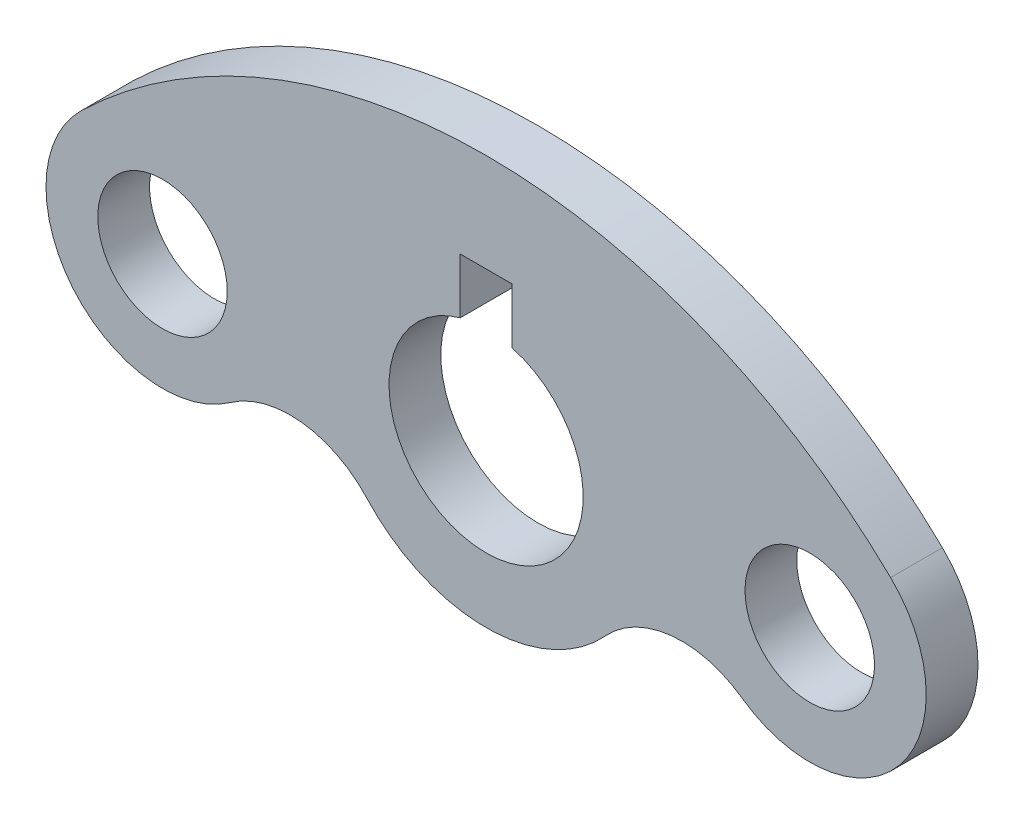
ISO-10303-21;
HEADER;
FILE_DESCRIPTION(('STEP AP214'),'2;1');
FILE_NAME('part.step','',(''),(''),'','','');
FILE_SCHEMA(('AUTOMOTIVE_DESIGN { 1 0 10303 214 1 1 1 1 }'));
ENDSEC;
DATA;
#1=APPLICATION_CONTEXT('core data for automotive mechanical design processes');
#2=APPLICATION_PROTOCOL_DEFINITION('international standard','automotive_design',2000,#1);
#3=PRODUCT_CONTEXT('',#1,'mechanical');
#4=PRODUCT('Part','Part','',(#3));
#5=PRODUCT_RELATED_PRODUCT_CATEGORY('part','',(#4));
#6=PRODUCT_DEFINITION_FORMATION('','',#4);
#7=PRODUCT_DEFINITION_CONTEXT('part definition',#1,'design');
#8=PRODUCT_DEFINITION('design','',#6,#7);
#9=PRODUCT_DEFINITION_SHAPE('','',#8);
#10=(LENGTH_UNIT() NAMED_UNIT(*) SI_UNIT(.MILLI.,.METRE.));
#11=(NAMED_UNIT(*) PLANE_ANGLE_UNIT() SI_UNIT($,.RADIAN.));
#12=(NAMED_UNIT(*) SI_UNIT($,.STERADIAN.) SOLID_ANGLE_UNIT());
#13=UNCERTAINTY_MEASURE_WITH_UNIT(LENGTH_MEASURE(1.E-05),#10,'distance_accuracy_value','');
#14=(GEOMETRIC_REPRESENTATION_CONTEXT(3) GLOBAL_UNCERTAINTY_ASSIGNED_CONTEXT((#13)) GLOBAL_UNIT_ASSIGNED_CONTEXT((#10,
#11,#12)) REPRESENTATION_CONTEXT('',''));
#15=CARTESIAN_POINT('',(0.,0.,0.));
#16=DIRECTION('',(0.,0.,1.));
#17=DIRECTION('',(1.,0.,0.));
#18=AXIS2_PLACEMENT_3D('',#15,#16,#17);
#19=CARTESIAN_POINT('',(25.,-25.9036676939772,8.));
#20=DIRECTION('',(0.,0.,1.));
#21=DIRECTION('',(1.,0.,0.));
#22=AXIS2_PLACEMENT_3D('',#19,#20,#21);
#23=PLANE('',#22);
#24=CARTESIAN_POINT('',(0.,0.,8.));
#25=DIRECTION('',(0.,0.,1.));
#26=DIRECTION('',(1.,0.,0.));
#27=AXIS2_PLACEMENT_3D('',#24,#25,#26);
#28=CIRCLE('',#27,15.);
#29=CARTESIAN_POINT('',(-4.,14.456832294801,8.));
#30=VERTEX_POINT('',#29);
#31=CARTESIAN_POINT('',(4.,14.456832294801,8.));
#32=VERTEX_POINT('',#31);
#33=EDGE_CURVE('E118',#30,#32,#28,.T.);
#34=ORIENTED_EDGE('',*,*,#33,.F.);
#35=DIRECTION('',(0.,-1.,0.));
#36=VECTOR('',#35,1.);
#37=CARTESIAN_POINT('',(-4.,23.,8.));
#38=LINE('',#37,#36);
#39=CARTESIAN_POINT('',(-4.,23.,8.));
#40=VERTEX_POINT('',#39);
#41=EDGE_CURVE('E110',#40,#30,#38,.T.);
#42=ORIENTED_EDGE('',*,*,#41,.F.);
#43=DIRECTION('',(-1.,0.,0.));
#44=VECTOR('',#43,1.);
#45=CARTESIAN_POINT('',(4.,23.,8.));
#46=LINE('',#45,#44);
#47=CARTESIAN_POINT('',(4.,23.,8.));
#48=VERTEX_POINT('',#47);
#49=EDGE_CURVE('E133',#48,#40,#46,.T.);
#50=ORIENTED_EDGE('',*,*,#49,.F.);
#51=DIRECTION('',(0.,1.,0.));
#52=VECTOR('',#51,1.);
#53=CARTESIAN_POINT('',(4.,14.456832294801,8.));
#54=LINE('',#53,#52);
#55=EDGE_CURVE('E131',#32,#48,#54,.T.);
#56=ORIENTED_EDGE('',*,*,#55,.F.);
#57=EDGE_LOOP('',(#34,#42,#50,#56));
#58=FACE_BOUND('',#57,.T.);
#59=CARTESIAN_POINT('',(-50.,0.,8.));
#60=DIRECTION('',(0.,0.,1.));
#61=DIRECTION('',(1.,0.,0.));
#62=AXIS2_PLACEMENT_3D('',#59,#60,#61);
#63=CIRCLE('',#62,10.);
#64=CARTESIAN_POINT('',(-40.,0.,8.));
#65=VERTEX_POINT('',#64);
#66=EDGE_CURVE('E149',#65,#65,#63,.T.);
#67=ORIENTED_EDGE('',*,*,#66,.F.);
#68=EDGE_LOOP('',(#67));
#69=FACE_BOUND('',#68,.T.);
#70=CARTESIAN_POINT('',(50.,0.,8.));
#71=DIRECTION('',(0.,0.,1.));
#72=DIRECTION('',(1.,0.,0.));
#73=AXIS2_PLACEMENT_3D('',#70,#71,#72);
#74=CIRCLE('',#73,18.);
#75=CARTESIAN_POINT('',(39.5441176470588,-14.6517754631121,8.));
#76=VERTEX_POINT('',#75);
#77=CARTESIAN_POINT('',(62.5,12.9518338469886,8.));
#78=VERTEX_POINT('',#77);
#79=EDGE_CURVE('E155',#76,#78,#74,.T.);
#80=ORIENTED_EDGE('',*,*,#79,.T.);
#81=CARTESIAN_POINT('',(0.,-51.8073353879545,8.));
#82=DIRECTION('',(0.,0.,1.));
#83=DIRECTION('',(-1.,0.,0.));
#84=AXIS2_PLACEMENT_3D('',#81,#82,#83);
#85=CIRCLE('',#84,90.);
#86=CARTESIAN_POINT('',(-62.5,12.9518338469886,8.));
#87=VERTEX_POINT('',#86);
#88=EDGE_CURVE('E158',#78,#87,#85,.T.);
#89=ORIENTED_EDGE('',*,*,#88,.T.);
#90=CARTESIAN_POINT('',(-50.,0.,8.));
#91=DIRECTION('',(0.,0.,1.));
#92=DIRECTION('',(1.,0.,0.));
#93=AXIS2_PLACEMENT_3D('',#90,#91,#92);
#94=CIRCLE('',#93,18.);
#95=CARTESIAN_POINT('',(-39.5441176470588,-14.6517754631121,8.));
#96=VERTEX_POINT('',#95);
#97=EDGE_CURVE('E161',#87,#96,#94,.T.);
#98=ORIENTED_EDGE('',*,*,#97,.T.);
#99=CARTESIAN_POINT('',(-30.25,-27.6755758747673,8.));
#100=DIRECTION('',(0.,0.,-1.));
#101=DIRECTION('',(1.,0.,0.));
#102=AXIS2_PLACEMENT_3D('',#99,#100,#101);
#103=CIRCLE('',#102,16.);
#104=CARTESIAN_POINT('',(-18.4451219512195,-16.8753511431508,8.));
#105=VERTEX_POINT('',#104);
#106=EDGE_CURVE('E163',#96,#105,#103,.T.);
#107=ORIENTED_EDGE('',*,*,#106,.T.);
#108=CARTESIAN_POINT('',(0.,0.,8.));
#109=DIRECTION('',(0.,0.,1.));
#110=DIRECTION('',(1.,0.,0.));
#111=AXIS2_PLACEMENT_3D('',#108,#109,#110);
#112=CIRCLE('',#111,25.);
#113=CARTESIAN_POINT('',(18.4451219512195,-16.8753511431508,8.));
#114=VERTEX_POINT('',#113);
#115=EDGE_CURVE('E165',#105,#114,#112,.T.);
#116=ORIENTED_EDGE('',*,*,#115,.T.);
#117=CARTESIAN_POINT('',(30.25,-27.6755758747673,8.));
#118=DIRECTION('',(0.,0.,-1.));
#119=DIRECTION('',(-1.,0.,0.));
#120=AXIS2_PLACEMENT_3D('',#117,#118,#119);
#121=CIRCLE('',#120,16.);
#122=EDGE_CURVE('E167',#114,#76,#121,.T.);
#123=ORIENTED_EDGE('',*,*,#122,.T.);
#124=EDGE_LOOP('',(#80,#89,#98,#107,#116,#123));
#125=FACE_BOUND('',#124,.T.);
#126=CARTESIAN_POINT('',(50.,0.,8.));
#127=DIRECTION('',(0.,0.,1.));
#128=DIRECTION('',(-1.,0.,0.));
#129=AXIS2_PLACEMENT_3D('',#126,#127,#128);
#130=CIRCLE('',#129,10.);
#131=CARTESIAN_POINT('',(40.,0.,8.));
#132=VERTEX_POINT('',#131);
#133=EDGE_CURVE('E139',#132,#132,#130,.T.);
#134=ORIENTED_EDGE('',*,*,#133,.F.);
#135=EDGE_LOOP('',(#134));
#136=FACE_BOUND('',#135,.T.);
#137=ADVANCED_FACE('F33',(#58,#69,#125,#136),#23,.T.);
#138=CARTESIAN_POINT('',(25.,-25.9036676939772,0.));
#139=DIRECTION('',(0.,0.,1.));
#140=DIRECTION('',(1.,0.,0.));
#141=AXIS2_PLACEMENT_3D('',#138,#139,#140);
#142=PLANE('',#141);
#143=CARTESIAN_POINT('',(-50.,0.,0.));
#144=DIRECTION('',(0.,0.,1.));
#145=DIRECTION('',(1.,0.,0.));
#146=AXIS2_PLACEMENT_3D('',#143,#144,#145);
#147=CIRCLE('',#146,10.);
#148=CARTESIAN_POINT('',(-40.,0.,0.));
#149=VERTEX_POINT('',#148);
#150=EDGE_CURVE('E126',#149,#149,#147,.T.);
#151=ORIENTED_EDGE('',*,*,#150,.T.);
#152=EDGE_LOOP('',(#151));
#153=FACE_BOUND('',#152,.T.);
#154=CARTESIAN_POINT('',(50.,0.,0.));
#155=DIRECTION('',(0.,0.,1.));
#156=DIRECTION('',(1.,0.,0.));
#157=AXIS2_PLACEMENT_3D('',#154,#155,#156);
#158=CIRCLE('',#157,18.);
#159=CARTESIAN_POINT('',(39.5441176470588,-14.6517754631121,0.));
#160=VERTEX_POINT('',#159);
#161=CARTESIAN_POINT('',(62.5,12.9518338469886,0.));
#162=VERTEX_POINT('',#161);
#163=EDGE_CURVE('E152',#160,#162,#158,.T.);
#164=ORIENTED_EDGE('',*,*,#163,.F.);
#165=CARTESIAN_POINT('',(30.25,-27.6755758747673,0.));
#166=DIRECTION('',(0.,0.,-1.));
#167=DIRECTION('',(-1.,0.,0.));
#168=AXIS2_PLACEMENT_3D('',#165,#166,#167);
#169=CIRCLE('',#168,16.);
#170=CARTESIAN_POINT('',(18.4451219512195,-16.8753511431508,0.));
#171=VERTEX_POINT('',#170);
#172=EDGE_CURVE('E159',#171,#160,#169,.T.);
#173=ORIENTED_EDGE('',*,*,#172,.F.);
#174=CARTESIAN_POINT('',(0.,0.,0.));
#175=DIRECTION('',(0.,0.,1.));
#176=DIRECTION('',(1.,0.,0.));
#177=AXIS2_PLACEMENT_3D('',#174,#175,#176);
#178=CIRCLE('',#177,25.);
#179=CARTESIAN_POINT('',(-18.4451219512195,-16.8753511431508,0.));
#180=VERTEX_POINT('',#179);
#181=EDGE_CURVE('E178',#180,#171,#178,.T.);
#182=ORIENTED_EDGE('',*,*,#181,.F.);
#183=CARTESIAN_POINT('',(-30.25,-27.6755758747673,0.));
#184=DIRECTION('',(0.,0.,-1.));
#185=DIRECTION('',(1.,0.,0.));
#186=AXIS2_PLACEMENT_3D('',#183,#184,#185);
#187=CIRCLE('',#186,16.);
#188=CARTESIAN_POINT('',(-39.5441176470588,-14.6517754631121,0.));
#189=VERTEX_POINT('',#188);
#190=EDGE_CURVE('E176',#189,#180,#187,.T.);
#191=ORIENTED_EDGE('',*,*,#190,.F.);
#192=CARTESIAN_POINT('',(-50.,0.,0.));
#193=DIRECTION('',(0.,0.,1.));
#194=DIRECTION('',(1.,0.,0.));
#195=AXIS2_PLACEMENT_3D('',#192,#193,#194);
#196=CIRCLE('',#195,18.);
#197=CARTESIAN_POINT('',(-62.5,12.9518338469886,0.));
#198=VERTEX_POINT('',#197);
#199=EDGE_CURVE('E174',#198,#189,#196,.T.);
#200=ORIENTED_EDGE('',*,*,#199,.F.);
#201=CARTESIAN_POINT('',(0.,-51.8073353879545,0.));
#202=DIRECTION('',(0.,0.,1.));
#203=DIRECTION('',(-1.,0.,0.));
#204=AXIS2_PLACEMENT_3D('',#201,#202,#203);
#205=CIRCLE('',#204,90.);
#206=EDGE_CURVE('E172',#162,#198,#205,.T.);
#207=ORIENTED_EDGE('',*,*,#206,.F.);
#208=EDGE_LOOP('',(#164,#173,#182,#191,#200,#207));
#209=FACE_BOUND('',#208,.T.);
#210=DIRECTION('',(0.,-1.,0.));
#211=VECTOR('',#210,1.);
#212=CARTESIAN_POINT('',(-4.,23.,0.));
#213=LINE('',#212,#211);
#214=CARTESIAN_POINT('',(-4.,23.,0.));
#215=VERTEX_POINT('',#214);
#216=CARTESIAN_POINT('',(-4.,14.456832294801,0.));
#217=VERTEX_POINT('',#216);
#218=EDGE_CURVE('E56',#215,#217,#213,.T.);
#219=ORIENTED_EDGE('',*,*,#218,.T.);
#220=CARTESIAN_POINT('',(0.,0.,0.));
#221=DIRECTION('',(0.,0.,1.));
#222=DIRECTION('',(1.,0.,0.));
#223=AXIS2_PLACEMENT_3D('',#220,#221,#222);
#224=CIRCLE('',#223,15.);
#225=CARTESIAN_POINT('',(4.,14.456832294801,0.));
#226=VERTEX_POINT('',#225);
#227=EDGE_CURVE('E125',#217,#226,#224,.T.);
#228=ORIENTED_EDGE('',*,*,#227,.T.);
#229=DIRECTION('',(0.,1.,0.));
#230=VECTOR('',#229,1.);
#231=CARTESIAN_POINT('',(4.,14.456832294801,0.));
#232=LINE('',#231,#230);
#233=CARTESIAN_POINT('',(4.,23.,0.));
#234=VERTEX_POINT('',#233);
#235=EDGE_CURVE('E141',#226,#234,#232,.T.);
#236=ORIENTED_EDGE('',*,*,#235,.T.);
#237=DIRECTION('',(-1.,0.,0.));
#238=VECTOR('',#237,1.);
#239=CARTESIAN_POINT('',(4.,23.,0.));
#240=LINE('',#239,#238);
#241=EDGE_CURVE('E119',#234,#215,#240,.T.);
#242=ORIENTED_EDGE('',*,*,#241,.T.);
#243=EDGE_LOOP('',(#219,#228,#236,#242));
#244=FACE_BOUND('',#243,.T.);
#245=CARTESIAN_POINT('',(50.,0.,0.));
#246=DIRECTION('',(0.,0.,1.));
#247=DIRECTION('',(-1.,0.,0.));
#248=AXIS2_PLACEMENT_3D('',#245,#246,#247);
#249=CIRCLE('',#248,10.);
#250=CARTESIAN_POINT('',(40.,0.,0.));
#251=VERTEX_POINT('',#250);
#252=EDGE_CURVE('E263',#251,#251,#249,.T.);
#253=ORIENTED_EDGE('',*,*,#252,.T.);
#254=EDGE_LOOP('',(#253));
#255=FACE_BOUND('',#254,.T.);
#256=ADVANCED_FACE('F202',(#153,#209,#244,#255),#142,.F.);
#257=CARTESIAN_POINT('',(50.,0.,8.));
#258=DIRECTION('',(0.,0.,-1.));
#259=DIRECTION('',(-1.,0.,0.));
#260=AXIS2_PLACEMENT_3D('',#257,#258,#259);
#261=CYLINDRICAL_SURFACE('',#260,18.);
#262=ORIENTED_EDGE('',*,*,#163,.T.);
#263=DIRECTION('',(0.,0.,-1.));
#264=VECTOR('',#263,1.);
#265=CARTESIAN_POINT('',(62.5,12.9518338469886,8.));
#266=LINE('',#265,#264);
#267=EDGE_CURVE('E11',#78,#162,#266,.T.);
#268=ORIENTED_EDGE('',*,*,#267,.F.);
#269=ORIENTED_EDGE('',*,*,#79,.F.);
#270=DIRECTION('',(0.,0.,-1.));
#271=VECTOR('',#270,1.);
#272=CARTESIAN_POINT('',(39.5441176470588,-14.6517754631121,8.));
#273=LINE('',#272,#271);
#274=EDGE_CURVE('E169',#76,#160,#273,.T.);
#275=ORIENTED_EDGE('',*,*,#274,.T.);
#276=EDGE_LOOP('',(#262,#268,#269,#275));
#277=FACE_BOUND('',#276,.T.);
#278=ADVANCED_FACE('F35',(#277),#261,.T.);
#279=CARTESIAN_POINT('',(0.,-51.8073353879545,8.));
#280=DIRECTION('',(0.,0.,-1.));
#281=DIRECTION('',(-1.,0.,0.));
#282=AXIS2_PLACEMENT_3D('',#279,#280,#281);
#283=CYLINDRICAL_SURFACE('',#282,90.);
#284=ORIENTED_EDGE('',*,*,#206,.T.);
#285=DIRECTION('',(0.,0.,-1.));
#286=VECTOR('',#285,1.);
#287=CARTESIAN_POINT('',(-62.5,12.9518338469886,8.));
#288=LINE('',#287,#286);
#289=EDGE_CURVE('E41',#87,#198,#288,.T.);
#290=ORIENTED_EDGE('',*,*,#289,.F.);
#291=ORIENTED_EDGE('',*,*,#88,.F.);
#292=ORIENTED_EDGE('',*,*,#267,.T.);
#293=EDGE_LOOP('',(#284,#290,#291,#292));
#294=FACE_BOUND('',#293,.T.);
#295=ADVANCED_FACE('F220',(#294),#283,.T.);
#296=CARTESIAN_POINT('',(-50.,0.,8.));
#297=DIRECTION('',(0.,0.,-1.));
#298=DIRECTION('',(-1.,0.,0.));
#299=AXIS2_PLACEMENT_3D('',#296,#297,#298);
#300=CYLINDRICAL_SURFACE('',#299,18.);
#301=ORIENTED_EDGE('',*,*,#199,.T.);
#302=DIRECTION('',(0.,0.,-1.));
#303=VECTOR('',#302,1.);
#304=CARTESIAN_POINT('',(-39.5441176470588,-14.6517754631121,8.));
#305=LINE('',#304,#303);
#306=EDGE_CURVE('E189',#96,#189,#305,.T.);
#307=ORIENTED_EDGE('',*,*,#306,.F.);
#308=ORIENTED_EDGE('',*,*,#97,.F.);
#309=ORIENTED_EDGE('',*,*,#289,.T.);
#310=EDGE_LOOP('',(#301,#307,#308,#309));
#311=FACE_BOUND('',#310,.T.);
#312=ADVANCED_FACE('F196',(#311),#300,.T.);
#313=CARTESIAN_POINT('',(-30.25,-27.6755758747673,8.));
#314=DIRECTION('',(0.,0.,-1.));
#315=DIRECTION('',(-1.,0.,0.));
#316=AXIS2_PLACEMENT_3D('',#313,#314,#315);
#317=CYLINDRICAL_SURFACE('',#316,16.);
#318=ORIENTED_EDGE('',*,*,#190,.T.);
#319=DIRECTION('',(0.,0.,-1.));
#320=VECTOR('',#319,1.);
#321=CARTESIAN_POINT('',(-18.4451219512195,-16.8753511431508,8.));
#322=LINE('',#321,#320);
#323=EDGE_CURVE('E186',#105,#180,#322,.T.);
#324=ORIENTED_EDGE('',*,*,#323,.F.);
#325=ORIENTED_EDGE('',*,*,#106,.F.);
#326=ORIENTED_EDGE('',*,*,#306,.T.);
#327=EDGE_LOOP('',(#318,#324,#325,#326));
#328=FACE_BOUND('',#327,.T.);
#329=ADVANCED_FACE('F208',(#328),#317,.F.);
#330=CARTESIAN_POINT('',(0.,0.,8.));
#331=DIRECTION('',(0.,0.,-1.));
#332=DIRECTION('',(-1.,0.,0.));
#333=AXIS2_PLACEMENT_3D('',#330,#331,#332);
#334=CYLINDRICAL_SURFACE('',#333,25.);
#335=ORIENTED_EDGE('',*,*,#181,.T.);
#336=DIRECTION('',(0.,0.,-1.));
#337=VECTOR('',#336,1.);
#338=CARTESIAN_POINT('',(18.4451219512195,-16.8753511431508,8.));
#339=LINE('',#338,#337);
#340=EDGE_CURVE('E183',#114,#171,#339,.T.);
#341=ORIENTED_EDGE('',*,*,#340,.F.);
#342=ORIENTED_EDGE('',*,*,#115,.F.);
#343=ORIENTED_EDGE('',*,*,#323,.T.);
#344=EDGE_LOOP('',(#335,#341,#342,#343));
#345=FACE_BOUND('',#344,.T.);
#346=ADVANCED_FACE('F212',(#345),#334,.T.);
#347=CARTESIAN_POINT('',(30.25,-27.6755758747673,8.));
#348=DIRECTION('',(0.,0.,-1.));
#349=DIRECTION('',(-1.,0.,0.));
#350=AXIS2_PLACEMENT_3D('',#347,#348,#349);
#351=CYLINDRICAL_SURFACE('',#350,16.);
#352=ORIENTED_EDGE('',*,*,#172,.T.);
#353=ORIENTED_EDGE('',*,*,#274,.F.);
#354=ORIENTED_EDGE('',*,*,#122,.F.);
#355=ORIENTED_EDGE('',*,*,#340,.T.);
#356=EDGE_LOOP('',(#352,#353,#354,#355));
#357=FACE_BOUND('',#356,.T.);
#358=ADVANCED_FACE('F223',(#357),#351,.F.);
#359=CARTESIAN_POINT('',(-50.,0.,8.));
#360=DIRECTION('',(0.,0.,-1.));
#361=DIRECTION('',(-1.,0.,0.));
#362=AXIS2_PLACEMENT_3D('',#359,#360,#361);
#363=CYLINDRICAL_SURFACE('',#362,10.);
#364=ORIENTED_EDGE('',*,*,#66,.T.);
#365=EDGE_LOOP('',(#364));
#366=FACE_BOUND('',#365,.T.);
#367=ORIENTED_EDGE('',*,*,#150,.F.);
#368=EDGE_LOOP('',(#367));
#369=FACE_BOUND('',#368,.T.);
#370=ADVANCED_FACE('F225',(#366,#369),#363,.F.);
#371=CARTESIAN_POINT('',(-4.,23.,8.));
#372=DIRECTION('',(1.,0.,0.));
#373=DIRECTION('',(0.,1.,0.));
#374=AXIS2_PLACEMENT_3D('',#371,#372,#373);
#375=PLANE('',#374);
#376=ORIENTED_EDGE('',*,*,#218,.F.);
#377=DIRECTION('',(0.,0.,-1.));
#378=VECTOR('',#377,1.);
#379=CARTESIAN_POINT('',(-4.,23.,8.));
#380=LINE('',#379,#378);
#381=EDGE_CURVE('E114',#40,#215,#380,.T.);
#382=ORIENTED_EDGE('',*,*,#381,.F.);
#383=ORIENTED_EDGE('',*,*,#41,.T.);
#384=DIRECTION('',(0.,0.,-1.));
#385=VECTOR('',#384,1.);
#386=CARTESIAN_POINT('',(-4.,14.456832294801,8.));
#387=LINE('',#386,#385);
#388=EDGE_CURVE('E113',#30,#217,#387,.T.);
#389=ORIENTED_EDGE('',*,*,#388,.T.);
#390=EDGE_LOOP('',(#376,#382,#383,#389));
#391=FACE_BOUND('',#390,.T.);
#392=ADVANCED_FACE('F112',(#391),#375,.T.);
#393=CARTESIAN_POINT('',(0.,0.,8.));
#394=DIRECTION('',(0.,0.,-1.));
#395=DIRECTION('',(-1.,0.,0.));
#396=AXIS2_PLACEMENT_3D('',#393,#394,#395);
#397=CYLINDRICAL_SURFACE('',#396,15.);
#398=ORIENTED_EDGE('',*,*,#227,.F.);
#399=ORIENTED_EDGE('',*,*,#388,.F.);
#400=ORIENTED_EDGE('',*,*,#33,.T.);
#401=DIRECTION('',(0.,0.,-1.));
#402=VECTOR('',#401,1.);
#403=CARTESIAN_POINT('',(4.,14.456832294801,8.));
#404=LINE('',#403,#402);
#405=EDGE_CURVE('E127',#32,#226,#404,.T.);
#406=ORIENTED_EDGE('',*,*,#405,.T.);
#407=EDGE_LOOP('',(#398,#399,#400,#406));
#408=FACE_BOUND('',#407,.T.);
#409=ADVANCED_FACE('F122',(#408),#397,.F.);
#410=CARTESIAN_POINT('',(4.,14.456832294801,8.));
#411=DIRECTION('',(-1.,0.,0.));
#412=DIRECTION('',(0.,-1.,0.));
#413=AXIS2_PLACEMENT_3D('',#410,#411,#412);
#414=PLANE('',#413);
#415=ORIENTED_EDGE('',*,*,#235,.F.);
#416=ORIENTED_EDGE('',*,*,#405,.F.);
#417=ORIENTED_EDGE('',*,*,#55,.T.);
#418=DIRECTION('',(0.,0.,-1.));
#419=VECTOR('',#418,1.);
#420=CARTESIAN_POINT('',(4.,23.,8.));
#421=LINE('',#420,#419);
#422=EDGE_CURVE('E48',#48,#234,#421,.T.);
#423=ORIENTED_EDGE('',*,*,#422,.T.);
#424=EDGE_LOOP('',(#415,#416,#417,#423));
#425=FACE_BOUND('',#424,.T.);
#426=ADVANCED_FACE('F246',(#425),#414,.T.);
#427=CARTESIAN_POINT('',(4.,23.,8.));
#428=DIRECTION('',(0.,-1.,0.));
#429=DIRECTION('',(0.,0.,-1.));
#430=AXIS2_PLACEMENT_3D('',#427,#428,#429);
#431=PLANE('',#430);
#432=ORIENTED_EDGE('',*,*,#241,.F.);
#433=ORIENTED_EDGE('',*,*,#422,.F.);
#434=ORIENTED_EDGE('',*,*,#49,.T.);
#435=ORIENTED_EDGE('',*,*,#381,.T.);
#436=EDGE_LOOP('',(#432,#433,#434,#435));
#437=FACE_BOUND('',#436,.T.);
#438=ADVANCED_FACE('F249',(#437),#431,.T.);
#439=CARTESIAN_POINT('',(50.,0.,8.));
#440=DIRECTION('',(0.,0.,-1.));
#441=DIRECTION('',(-1.,0.,0.));
#442=AXIS2_PLACEMENT_3D('',#439,#440,#441);
#443=CYLINDRICAL_SURFACE('',#442,10.);
#444=ORIENTED_EDGE('',*,*,#133,.T.);
#445=EDGE_LOOP('',(#444));
#446=FACE_BOUND('',#445,.T.);
#447=ORIENTED_EDGE('',*,*,#252,.F.);
#448=EDGE_LOOP('',(#447));
#449=FACE_BOUND('',#448,.T.);
#450=ADVANCED_FACE('F253',(#446,#449),#443,.F.);
#451=CLOSED_SHELL('',(#137,#256,#278,#295,#312,#329,#346,#358,#370,#392,#409,#426,#438,#450));
#452=MANIFOLD_SOLID_BREP('B2',#451);
#453=ADVANCED_BREP_SHAPE_REPRESENTATION('',(#18,#452),#14);
#454=SHAPE_DEFINITION_REPRESENTATION(#9,#453);
ENDSEC;
END-ISO-10303-21;
